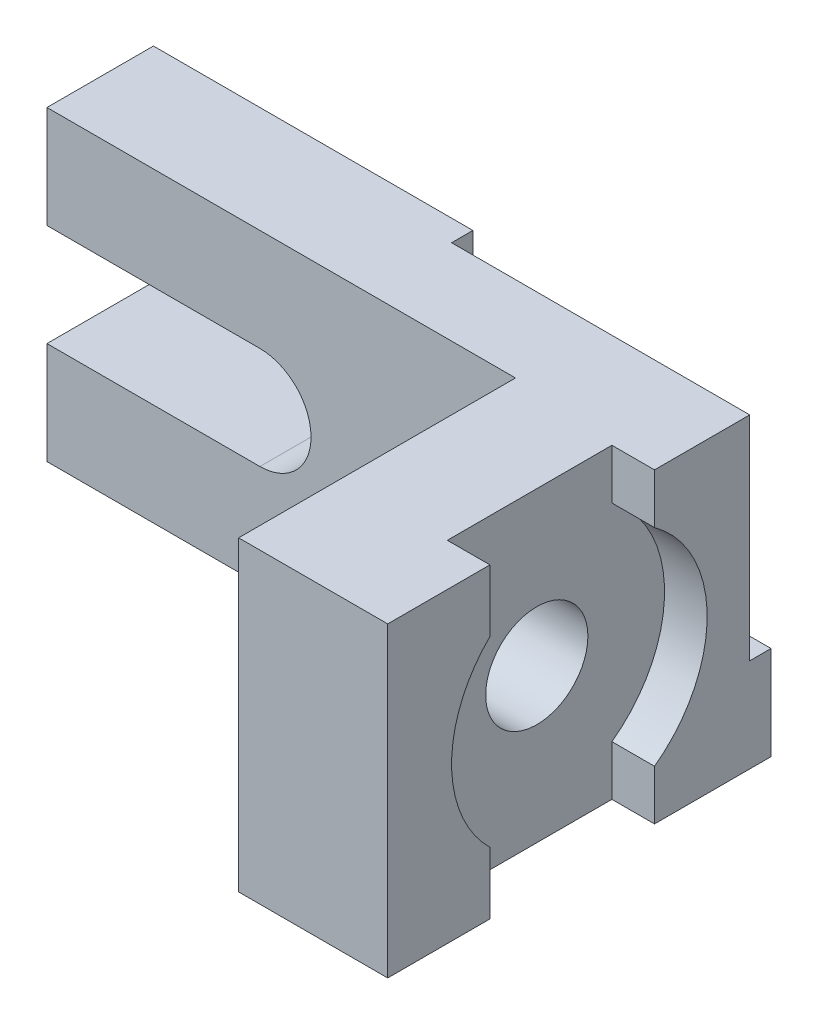
ISO-10303-21;
HEADER;
FILE_DESCRIPTION(('STEP AP214'),'2;1');
FILE_NAME('part.step','',(''),(''),'','','');
FILE_SCHEMA(('AUTOMOTIVE_DESIGN { 1 0 10303 214 1 1 1 1 }'));
ENDSEC;
DATA;
#1=APPLICATION_CONTEXT('core data for automotive mechanical design processes');
#2=APPLICATION_PROTOCOL_DEFINITION('international standard','automotive_design',2000,#1);
#3=PRODUCT_CONTEXT('',#1,'mechanical');
#4=PRODUCT('Part','Part','',(#3));
#5=PRODUCT_RELATED_PRODUCT_CATEGORY('part','',(#4));
#6=PRODUCT_DEFINITION_FORMATION('','',#4);
#7=PRODUCT_DEFINITION_CONTEXT('part definition',#1,'design');
#8=PRODUCT_DEFINITION('design','',#6,#7);
#9=PRODUCT_DEFINITION_SHAPE('','',#8);
#10=(LENGTH_UNIT() NAMED_UNIT(*) SI_UNIT(.MILLI.,.METRE.));
#11=(NAMED_UNIT(*) PLANE_ANGLE_UNIT() SI_UNIT($,.RADIAN.));
#12=(NAMED_UNIT(*) SI_UNIT($,.STERADIAN.) SOLID_ANGLE_UNIT());
#13=UNCERTAINTY_MEASURE_WITH_UNIT(LENGTH_MEASURE(1.E-05),#10,'distance_accuracy_value','');
#14=(GEOMETRIC_REPRESENTATION_CONTEXT(3) GLOBAL_UNCERTAINTY_ASSIGNED_CONTEXT((#13)) GLOBAL_UNIT_ASSIGNED_CONTEXT((#10,
#11,#12)) REPRESENTATION_CONTEXT('',''));
#15=CARTESIAN_POINT('',(0.,0.,0.));
#16=DIRECTION('',(0.,0.,1.));
#17=DIRECTION('',(1.,0.,0.));
#18=AXIS2_PLACEMENT_3D('',#15,#16,#17);
#19=CARTESIAN_POINT('',(-145.,36.,0.));
#20=DIRECTION('',(1.,0.,0.));
#21=DIRECTION('',(0.,0.,-1.));
#22=AXIS2_PLACEMENT_3D('',#19,#20,#21);
#23=PLANE('',#22);
#24=DIRECTION('',(0.,-1.,0.));
#25=VECTOR('',#24,1.);
#26=CARTESIAN_POINT('',(-145.,36.,25.));
#27=LINE('',#26,#25);
#28=CARTESIAN_POINT('',(-145.,-12.,25.));
#29=VERTEX_POINT('',#28);
#30=CARTESIAN_POINT('',(-145.,-36.,25.));
#31=VERTEX_POINT('',#30);
#32=EDGE_CURVE('E208',#29,#31,#27,.T.);
#33=ORIENTED_EDGE('',*,*,#32,.F.);
#34=DIRECTION('',(0.,0.,1.));
#35=VECTOR('',#34,1.);
#36=CARTESIAN_POINT('',(-145.,-12.,-45.));
#37=LINE('',#36,#35);
#38=CARTESIAN_POINT('',(-145.,-12.,0.));
#39=VERTEX_POINT('',#38);
#40=EDGE_CURVE('E202',#39,#29,#37,.T.);
#41=ORIENTED_EDGE('',*,*,#40,.F.);
#42=DIRECTION('',(0.,-1.,0.));
#43=VECTOR('',#42,1.);
#44=CARTESIAN_POINT('',(-145.,36.,0.));
#45=LINE('',#44,#43);
#46=CARTESIAN_POINT('',(-145.,-36.,0.));
#47=VERTEX_POINT('',#46);
#48=EDGE_CURVE('E207',#39,#47,#45,.T.);
#49=ORIENTED_EDGE('',*,*,#48,.T.);
#50=DIRECTION('',(0.,0.,1.));
#51=VECTOR('',#50,1.);
#52=CARTESIAN_POINT('',(-145.,-36.,0.));
#53=LINE('',#52,#51);
#54=EDGE_CURVE('E229',#47,#31,#53,.T.);
#55=ORIENTED_EDGE('',*,*,#54,.T.);
#56=EDGE_LOOP('',(#33,#41,#49,#55));
#57=FACE_BOUND('',#56,.T.);
#58=ADVANCED_FACE('F39',(#57),#23,.F.);
#59=CARTESIAN_POINT('',(0.,36.,90.));
#60=DIRECTION('',(-1.,0.,0.));
#61=DIRECTION('',(0.,0.,1.));
#62=AXIS2_PLACEMENT_3D('',#59,#60,#61);
#63=PLANE('',#62);
#64=DIRECTION('',(0.,-1.,0.));
#65=VECTOR('',#64,1.);
#66=CARTESIAN_POINT('',(0.,36.,0.));
#67=LINE('',#66,#65);
#68=CARTESIAN_POINT('',(0.,-14.,0.));
#69=VERTEX_POINT('',#68);
#70=CARTESIAN_POINT('',(0.,-36.,0.));
#71=VERTEX_POINT('',#70);
#72=EDGE_CURVE('E11',#69,#71,#67,.T.);
#73=ORIENTED_EDGE('',*,*,#72,.F.);
#74=DIRECTION('',(0.,0.,-1.));
#75=VECTOR('',#74,1.);
#76=CARTESIAN_POINT('',(0.,-14.,4.99999999999999));
#77=LINE('',#76,#75);
#78=CARTESIAN_POINT('',(0.,-14.,4.99999999999999));
#79=VERTEX_POINT('',#78);
#80=EDGE_CURVE('E305',#79,#69,#77,.T.);
#81=ORIENTED_EDGE('',*,*,#80,.F.);
#82=DIRECTION('',(0.,-1.,0.));
#83=VECTOR('',#82,1.);
#84=CARTESIAN_POINT('',(0.,36.,5.));
#85=LINE('',#84,#83);
#86=CARTESIAN_POINT('',(0.,36.,5.));
#87=VERTEX_POINT('',#86);
#88=EDGE_CURVE('E307',#87,#79,#85,.T.);
#89=ORIENTED_EDGE('',*,*,#88,.F.);
#90=DIRECTION('',(0.,0.,-1.));
#91=VECTOR('',#90,1.);
#92=CARTESIAN_POINT('',(0.,36.,90.));
#93=LINE('',#92,#91);
#94=CARTESIAN_POINT('',(0.,36.,27.3608706282374));
#95=VERTEX_POINT('',#94);
#96=EDGE_CURVE('E224',#95,#87,#93,.T.);
#97=ORIENTED_EDGE('',*,*,#96,.F.);
#98=DIRECTION('',(0.,1.,0.));
#99=VECTOR('',#98,1.);
#100=CARTESIAN_POINT('',(0.,-36.,27.3608706282374));
#101=LINE('',#100,#99);
#102=CARTESIAN_POINT('',(0.,24.2664607020929,27.3608706282374));
#103=VERTEX_POINT('',#102);
#104=EDGE_CURVE('E278',#103,#95,#101,.T.);
#105=ORIENTED_EDGE('',*,*,#104,.F.);
#106=CARTESIAN_POINT('',(0.,0.,45.));
#107=DIRECTION('',(-1.,0.,0.));
#108=DIRECTION('',(0.,0.,1.));
#109=AXIS2_PLACEMENT_3D('',#106,#107,#108);
#110=CIRCLE('',#109,30.);
#111=CARTESIAN_POINT('',(0.,-24.2664607020929,27.3608706282374));
#112=VERTEX_POINT('',#111);
#113=EDGE_CURVE('E413',#112,#103,#110,.F.);
#114=ORIENTED_EDGE('',*,*,#113,.F.);
#115=CARTESIAN_POINT('',(0.,-36.,27.3608706282374));
#116=VERTEX_POINT('',#115);
#117=EDGE_CURVE('E275',#116,#112,#101,.T.);
#118=ORIENTED_EDGE('',*,*,#117,.F.);
#119=DIRECTION('',(0.,0.,-1.));
#120=VECTOR('',#119,1.);
#121=CARTESIAN_POINT('',(0.,-36.,90.));
#122=LINE('',#121,#120);
#123=EDGE_CURVE('E238',#116,#71,#122,.T.);
#124=ORIENTED_EDGE('',*,*,#123,.T.);
#125=EDGE_LOOP('',(#73,#81,#89,#97,#105,#114,#118,#124));
#126=FACE_BOUND('',#125,.T.);
#127=ADVANCED_FACE('F373',(#126),#63,.F.);
#128=CARTESIAN_POINT('',(1.2E-05,0.,45.));
#129=DIRECTION('',(-1.,0.,0.));
#130=DIRECTION('',(0.,0.,1.));
#131=AXIS2_PLACEMENT_3D('',#128,#129,#130);
#132=CYLINDRICAL_SURFACE('',#131,30.);
#133=DIRECTION('',(-1.,0.,0.));
#134=VECTOR('',#133,1.);
#135=CARTESIAN_POINT('',(1.2E-05,-24.2664607020929,27.3608706282374));
#136=LINE('',#135,#134);
#137=CARTESIAN_POINT('',(-10.,-24.2664607020929,27.3608706282374));
#138=VERTEX_POINT('',#137);
#139=EDGE_CURVE('E254',#112,#138,#136,.T.);
#140=ORIENTED_EDGE('',*,*,#139,.F.);
#141=ORIENTED_EDGE('',*,*,#113,.T.);
#142=DIRECTION('',(-1.,0.,0.));
#143=VECTOR('',#142,1.);
#144=CARTESIAN_POINT('',(1.2E-05,24.2664607020929,27.3608706282374));
#145=LINE('',#144,#143);
#146=CARTESIAN_POINT('',(-10.,24.2664607020929,27.3608706282374));
#147=VERTEX_POINT('',#146);
#148=EDGE_CURVE('E257',#147,#103,#145,.F.);
#149=ORIENTED_EDGE('',*,*,#148,.F.);
#150=CARTESIAN_POINT('',(-10.,0.,45.));
#151=DIRECTION('',(1.,0.,0.));
#152=DIRECTION('',(0.,0.,-1.));
#153=AXIS2_PLACEMENT_3D('',#150,#151,#152);
#154=CIRCLE('',#153,30.);
#155=EDGE_CURVE('E250',#138,#147,#154,.T.);
#156=ORIENTED_EDGE('',*,*,#155,.F.);
#157=EDGE_LOOP('',(#140,#141,#149,#156));
#158=FACE_BOUND('',#157,.T.);
#159=ADVANCED_FACE('F379',(#158),#132,.F.);
#160=CARTESIAN_POINT('',(0.,-36.,90.));
#161=VERTEX_POINT('',#160);
#162=CARTESIAN_POINT('',(0.,-36.,66.));
#163=VERTEX_POINT('',#162);
#164=EDGE_CURVE('E235',#161,#163,#122,.T.);
#165=ORIENTED_EDGE('',*,*,#164,.T.);
#166=DIRECTION('',(0.,-1.,0.));
#167=VECTOR('',#166,1.);
#168=CARTESIAN_POINT('',(0.,-36.,66.));
#169=LINE('',#168,#167);
#170=CARTESIAN_POINT('',(0.,-21.4242852856285,66.));
#171=VERTEX_POINT('',#170);
#172=EDGE_CURVE('E281',#171,#163,#169,.T.);
#173=ORIENTED_EDGE('',*,*,#172,.F.);
#174=CARTESIAN_POINT('',(0.,21.4242852856285,66.));
#175=VERTEX_POINT('',#174);
#176=EDGE_CURVE('E43',#175,#171,#110,.F.);
#177=ORIENTED_EDGE('',*,*,#176,.F.);
#178=CARTESIAN_POINT('',(0.,36.,66.));
#179=VERTEX_POINT('',#178);
#180=EDGE_CURVE('E279',#179,#175,#169,.T.);
#181=ORIENTED_EDGE('',*,*,#180,.F.);
#182=CARTESIAN_POINT('',(0.,36.,90.));
#183=VERTEX_POINT('',#182);
#184=EDGE_CURVE('E247',#183,#179,#93,.T.);
#185=ORIENTED_EDGE('',*,*,#184,.F.);
#186=DIRECTION('',(0.,-1.,0.));
#187=VECTOR('',#186,1.);
#188=CARTESIAN_POINT('',(0.,36.,90.));
#189=LINE('',#188,#187);
#190=EDGE_CURVE('E218',#183,#161,#189,.T.);
#191=ORIENTED_EDGE('',*,*,#190,.T.);
#192=EDGE_LOOP('',(#165,#173,#177,#181,#185,#191));
#193=FACE_BOUND('',#192,.T.);
#194=ADVANCED_FACE('F41',(#193),#63,.F.);
#195=CARTESIAN_POINT('',(0.,36.,0.));
#196=DIRECTION('',(0.,0.,1.));
#197=DIRECTION('',(1.,0.,0.));
#198=AXIS2_PLACEMENT_3D('',#195,#196,#197);
#199=PLANE('',#198);
#200=ORIENTED_EDGE('',*,*,#48,.F.);
#201=DIRECTION('',(1.,0.,0.));
#202=VECTOR('',#201,1.);
#203=CARTESIAN_POINT('',(0.,-12.,0.));
#204=LINE('',#203,#202);
#205=CARTESIAN_POINT('',(-95.,-12.,0.));
#206=VERTEX_POINT('',#205);
#207=EDGE_CURVE('E320',#39,#206,#204,.T.);
#208=ORIENTED_EDGE('',*,*,#207,.T.);
#209=CARTESIAN_POINT('',(-95.,0.,0.));
#210=DIRECTION('',(0.,0.,1.));
#211=DIRECTION('',(1.,0.,0.));
#212=AXIS2_PLACEMENT_3D('',#209,#210,#211);
#213=CIRCLE('',#212,12.);
#214=CARTESIAN_POINT('',(-95.,12.,0.));
#215=VERTEX_POINT('',#214);
#216=EDGE_CURVE('E310',#206,#215,#213,.T.);
#217=ORIENTED_EDGE('',*,*,#216,.T.);
#218=DIRECTION('',(-1.,0.,0.));
#219=VECTOR('',#218,1.);
#220=CARTESIAN_POINT('',(0.,12.,0.));
#221=LINE('',#220,#219);
#222=CARTESIAN_POINT('',(-145.,12.,0.));
#223=VERTEX_POINT('',#222);
#224=EDGE_CURVE('E323',#215,#223,#221,.T.);
#225=ORIENTED_EDGE('',*,*,#224,.T.);
#226=CARTESIAN_POINT('',(-145.,36.,0.));
#227=VERTEX_POINT('',#226);
#228=EDGE_CURVE('E48',#227,#223,#45,.T.);
#229=ORIENTED_EDGE('',*,*,#228,.F.);
#230=DIRECTION('',(-1.,0.,0.));
#231=VECTOR('',#230,1.);
#232=CARTESIAN_POINT('',(0.,36.,0.));
#233=LINE('',#232,#231);
#234=CARTESIAN_POINT('',(-70.,36.,0.));
#235=VERTEX_POINT('',#234);
#236=EDGE_CURVE('E245',#235,#227,#233,.T.);
#237=ORIENTED_EDGE('',*,*,#236,.F.);
#238=DIRECTION('',(0.,1.,0.));
#239=VECTOR('',#238,1.);
#240=CARTESIAN_POINT('',(-70.,-14.,0.));
#241=LINE('',#240,#239);
#242=CARTESIAN_POINT('',(-70.,-14.,0.));
#243=VERTEX_POINT('',#242);
#244=EDGE_CURVE('E63',#243,#235,#241,.T.);
#245=ORIENTED_EDGE('',*,*,#244,.F.);
#246=DIRECTION('',(1.,0.,0.));
#247=VECTOR('',#246,1.);
#248=CARTESIAN_POINT('',(-70.,-14.,0.));
#249=LINE('',#248,#247);
#250=EDGE_CURVE('E297',#243,#69,#249,.T.);
#251=ORIENTED_EDGE('',*,*,#250,.T.);
#252=ORIENTED_EDGE('',*,*,#72,.T.);
#253=DIRECTION('',(-1.,0.,0.));
#254=VECTOR('',#253,1.);
#255=CARTESIAN_POINT('',(0.,-36.,0.));
#256=LINE('',#255,#254);
#257=EDGE_CURVE('E232',#71,#47,#256,.T.);
#258=ORIENTED_EDGE('',*,*,#257,.T.);
#259=EDGE_LOOP('',(#200,#208,#217,#225,#229,#237,#245,#251,#252,#258));
#260=FACE_BOUND('',#259,.T.);
#261=ADVANCED_FACE('F358',(#260),#199,.F.);
#262=ORIENTED_EDGE('',*,*,#228,.T.);
#263=DIRECTION('',(0.,0.,1.));
#264=VECTOR('',#263,1.);
#265=CARTESIAN_POINT('',(-145.,12.,-45.));
#266=LINE('',#265,#264);
#267=CARTESIAN_POINT('',(-145.,12.,25.));
#268=VERTEX_POINT('',#267);
#269=EDGE_CURVE('E187',#223,#268,#266,.T.);
#270=ORIENTED_EDGE('',*,*,#269,.T.);
#271=CARTESIAN_POINT('',(-145.,36.,25.));
#272=VERTEX_POINT('',#271);
#273=EDGE_CURVE('E199',#272,#268,#27,.T.);
#274=ORIENTED_EDGE('',*,*,#273,.F.);
#275=DIRECTION('',(0.,0.,1.));
#276=VECTOR('',#275,1.);
#277=CARTESIAN_POINT('',(-145.,36.,0.));
#278=LINE('',#277,#276);
#279=EDGE_CURVE('E243',#227,#272,#278,.T.);
#280=ORIENTED_EDGE('',*,*,#279,.F.);
#281=EDGE_LOOP('',(#262,#270,#274,#280));
#282=FACE_BOUND('',#281,.T.);
#283=ADVANCED_FACE('F197',(#282),#23,.F.);
#284=CARTESIAN_POINT('',(-145.,36.,25.));
#285=DIRECTION('',(0.,0.,-1.));
#286=DIRECTION('',(-1.,0.,0.));
#287=AXIS2_PLACEMENT_3D('',#284,#285,#286);
#288=PLANE('',#287);
#289=CARTESIAN_POINT('',(-95.,0.,25.));
#290=DIRECTION('',(0.,0.,1.));
#291=DIRECTION('',(1.,0.,0.));
#292=AXIS2_PLACEMENT_3D('',#289,#290,#291);
#293=CIRCLE('',#292,12.);
#294=CARTESIAN_POINT('',(-95.,-12.,25.));
#295=VERTEX_POINT('',#294);
#296=CARTESIAN_POINT('',(-95.,12.,25.));
#297=VERTEX_POINT('',#296);
#298=EDGE_CURVE('E55',#295,#297,#293,.T.);
#299=ORIENTED_EDGE('',*,*,#298,.F.);
#300=DIRECTION('',(1.,0.,0.));
#301=VECTOR('',#300,1.);
#302=CARTESIAN_POINT('',(-95.,-12.,25.));
#303=LINE('',#302,#301);
#304=EDGE_CURVE('E192',#29,#295,#303,.T.);
#305=ORIENTED_EDGE('',*,*,#304,.F.);
#306=ORIENTED_EDGE('',*,*,#32,.T.);
#307=DIRECTION('',(1.,0.,0.));
#308=VECTOR('',#307,1.);
#309=CARTESIAN_POINT('',(-145.,-36.,25.));
#310=LINE('',#309,#308);
#311=CARTESIAN_POINT('',(-35.,-36.,25.));
#312=VERTEX_POINT('',#311);
#313=EDGE_CURVE('E227',#31,#312,#310,.T.);
#314=ORIENTED_EDGE('',*,*,#313,.T.);
#315=DIRECTION('',(0.,-1.,0.));
#316=VECTOR('',#315,1.);
#317=CARTESIAN_POINT('',(-35.,36.,25.));
#318=LINE('',#317,#316);
#319=CARTESIAN_POINT('',(-35.,36.,25.));
#320=VERTEX_POINT('',#319);
#321=EDGE_CURVE('E211',#320,#312,#318,.T.);
#322=ORIENTED_EDGE('',*,*,#321,.F.);
#323=DIRECTION('',(1.,0.,0.));
#324=VECTOR('',#323,1.);
#325=CARTESIAN_POINT('',(-145.,36.,25.));
#326=LINE('',#325,#324);
#327=EDGE_CURVE('E206',#272,#320,#326,.T.);
#328=ORIENTED_EDGE('',*,*,#327,.F.);
#329=ORIENTED_EDGE('',*,*,#273,.T.);
#330=DIRECTION('',(-1.,0.,0.));
#331=VECTOR('',#330,1.);
#332=CARTESIAN_POINT('',(-95.,12.,25.));
#333=LINE('',#332,#331);
#334=EDGE_CURVE('E184',#297,#268,#333,.T.);
#335=ORIENTED_EDGE('',*,*,#334,.F.);
#336=EDGE_LOOP('',(#299,#305,#306,#314,#322,#328,#329,#335));
#337=FACE_BOUND('',#336,.T.);
#338=ADVANCED_FACE('F204',(#337),#288,.F.);
#339=CARTESIAN_POINT('',(-35.,36.,25.));
#340=DIRECTION('',(1.,0.,0.));
#341=DIRECTION('',(0.,0.,-1.));
#342=AXIS2_PLACEMENT_3D('',#339,#340,#341);
#343=PLANE('',#342);
#344=CARTESIAN_POINT('',(-35.,0.,45.));
#345=DIRECTION('',(1.,0.,0.));
#346=DIRECTION('',(0.,0.,-1.));
#347=AXIS2_PLACEMENT_3D('',#344,#345,#346);
#348=CIRCLE('',#347,12.);
#349=CARTESIAN_POINT('',(-35.,0.,33.));
#350=VERTEX_POINT('',#349);
#351=EDGE_CURVE('E291',#350,#350,#348,.T.);
#352=ORIENTED_EDGE('',*,*,#351,.T.);
#353=EDGE_LOOP('',(#352));
#354=FACE_BOUND('',#353,.T.);
#355=DIRECTION('',(0.,0.,1.));
#356=VECTOR('',#355,1.);
#357=CARTESIAN_POINT('',(-35.,-36.,25.));
#358=LINE('',#357,#356);
#359=CARTESIAN_POINT('',(-35.,-36.,90.));
#360=VERTEX_POINT('',#359);
#361=EDGE_CURVE('E225',#312,#360,#358,.T.);
#362=ORIENTED_EDGE('',*,*,#361,.T.);
#363=DIRECTION('',(0.,-1.,0.));
#364=VECTOR('',#363,1.);
#365=CARTESIAN_POINT('',(-35.,36.,90.));
#366=LINE('',#365,#364);
#367=CARTESIAN_POINT('',(-35.,36.,90.));
#368=VERTEX_POINT('',#367);
#369=EDGE_CURVE('E215',#368,#360,#366,.T.);
#370=ORIENTED_EDGE('',*,*,#369,.F.);
#371=DIRECTION('',(0.,0.,1.));
#372=VECTOR('',#371,1.);
#373=CARTESIAN_POINT('',(-35.,36.,25.));
#374=LINE('',#373,#372);
#375=EDGE_CURVE('E240',#320,#368,#374,.T.);
#376=ORIENTED_EDGE('',*,*,#375,.F.);
#377=ORIENTED_EDGE('',*,*,#321,.T.);
#378=EDGE_LOOP('',(#362,#370,#376,#377));
#379=FACE_BOUND('',#378,.T.);
#380=ADVANCED_FACE('F349',(#354,#379),#343,.F.);
#381=CARTESIAN_POINT('',(-35.,36.,90.));
#382=DIRECTION('',(0.,0.,-1.));
#383=DIRECTION('',(-1.,0.,0.));
#384=AXIS2_PLACEMENT_3D('',#381,#382,#383);
#385=PLANE('',#384);
#386=DIRECTION('',(1.,0.,0.));
#387=VECTOR('',#386,1.);
#388=CARTESIAN_POINT('',(-35.,-36.,90.));
#389=LINE('',#388,#387);
#390=EDGE_CURVE('E222',#360,#161,#389,.T.);
#391=ORIENTED_EDGE('',*,*,#390,.T.);
#392=ORIENTED_EDGE('',*,*,#190,.F.);
#393=DIRECTION('',(1.,0.,0.));
#394=VECTOR('',#393,1.);
#395=CARTESIAN_POINT('',(-35.,36.,90.));
#396=LINE('',#395,#394);
#397=EDGE_CURVE('E221',#368,#183,#396,.T.);
#398=ORIENTED_EDGE('',*,*,#397,.F.);
#399=ORIENTED_EDGE('',*,*,#369,.T.);
#400=EDGE_LOOP('',(#391,#392,#398,#399));
#401=FACE_BOUND('',#400,.T.);
#402=ADVANCED_FACE('F563',(#401),#385,.F.);
#403=CARTESIAN_POINT('',(0.,36.,0.));
#404=DIRECTION('',(0.,1.,0.));
#405=DIRECTION('',(0.,0.,1.));
#406=AXIS2_PLACEMENT_3D('',#403,#404,#405);
#407=PLANE('',#406);
#408=DIRECTION('',(1.,0.,0.));
#409=VECTOR('',#408,1.);
#410=CARTESIAN_POINT('',(-70.,36.,5.));
#411=LINE('',#410,#409);
#412=CARTESIAN_POINT('',(-70.,36.,5.));
#413=VERTEX_POINT('',#412);
#414=EDGE_CURVE('E298',#413,#87,#411,.T.);
#415=ORIENTED_EDGE('',*,*,#414,.F.);
#416=DIRECTION('',(0.,0.,1.));
#417=VECTOR('',#416,1.);
#418=CARTESIAN_POINT('',(-70.,36.,0.));
#419=LINE('',#418,#417);
#420=EDGE_CURVE('E315',#235,#413,#419,.T.);
#421=ORIENTED_EDGE('',*,*,#420,.F.);
#422=ORIENTED_EDGE('',*,*,#236,.T.);
#423=ORIENTED_EDGE('',*,*,#279,.T.);
#424=ORIENTED_EDGE('',*,*,#327,.T.);
#425=ORIENTED_EDGE('',*,*,#375,.T.);
#426=ORIENTED_EDGE('',*,*,#397,.T.);
#427=ORIENTED_EDGE('',*,*,#184,.T.);
#428=DIRECTION('',(1.,0.,0.));
#429=VECTOR('',#428,1.);
#430=CARTESIAN_POINT('',(-10.,36.,66.));
#431=LINE('',#430,#429);
#432=CARTESIAN_POINT('',(-10.,36.,66.));
#433=VERTEX_POINT('',#432);
#434=EDGE_CURVE('E265',#433,#179,#431,.T.);
#435=ORIENTED_EDGE('',*,*,#434,.F.);
#436=DIRECTION('',(0.,0.,1.));
#437=VECTOR('',#436,1.);
#438=CARTESIAN_POINT('',(-10.,36.,66.));
#439=LINE('',#438,#437);
#440=CARTESIAN_POINT('',(-10.,36.,27.3608706282374));
#441=VERTEX_POINT('',#440);
#442=EDGE_CURVE('E277',#441,#433,#439,.T.);
#443=ORIENTED_EDGE('',*,*,#442,.F.);
#444=DIRECTION('',(1.,0.,0.));
#445=VECTOR('',#444,1.);
#446=CARTESIAN_POINT('',(-10.,36.,27.3608706282374));
#447=LINE('',#446,#445);
#448=EDGE_CURVE('E264',#441,#95,#447,.T.);
#449=ORIENTED_EDGE('',*,*,#448,.T.);
#450=ORIENTED_EDGE('',*,*,#96,.T.);
#451=EDGE_LOOP('',(#415,#421,#422,#423,#424,#425,#426,#427,#435,#443,#449,#450));
#452=FACE_BOUND('',#451,.T.);
#453=ADVANCED_FACE('F354',(#452),#407,.T.);
#454=CARTESIAN_POINT('',(0.,-36.,0.));
#455=DIRECTION('',(0.,1.,0.));
#456=DIRECTION('',(0.,0.,1.));
#457=AXIS2_PLACEMENT_3D('',#454,#455,#456);
#458=PLANE('',#457);
#459=ORIENTED_EDGE('',*,*,#123,.F.);
#460=DIRECTION('',(1.,0.,0.));
#461=VECTOR('',#460,1.);
#462=CARTESIAN_POINT('',(-10.,-36.,27.3608706282374));
#463=LINE('',#462,#461);
#464=CARTESIAN_POINT('',(-10.,-36.,27.3608706282374));
#465=VERTEX_POINT('',#464);
#466=EDGE_CURVE('E271',#465,#116,#463,.T.);
#467=ORIENTED_EDGE('',*,*,#466,.F.);
#468=DIRECTION('',(0.,0.,-1.));
#469=VECTOR('',#468,1.);
#470=CARTESIAN_POINT('',(-10.,-36.,66.));
#471=LINE('',#470,#469);
#472=CARTESIAN_POINT('',(-10.,-36.,66.));
#473=VERTEX_POINT('',#472);
#474=EDGE_CURVE('E284',#473,#465,#471,.T.);
#475=ORIENTED_EDGE('',*,*,#474,.F.);
#476=DIRECTION('',(1.,0.,0.));
#477=VECTOR('',#476,1.);
#478=CARTESIAN_POINT('',(-10.,-36.,66.));
#479=LINE('',#478,#477);
#480=EDGE_CURVE('E267',#473,#163,#479,.T.);
#481=ORIENTED_EDGE('',*,*,#480,.T.);
#482=ORIENTED_EDGE('',*,*,#164,.F.);
#483=ORIENTED_EDGE('',*,*,#390,.F.);
#484=ORIENTED_EDGE('',*,*,#361,.F.);
#485=ORIENTED_EDGE('',*,*,#313,.F.);
#486=ORIENTED_EDGE('',*,*,#54,.F.);
#487=ORIENTED_EDGE('',*,*,#257,.F.);
#488=EDGE_LOOP('',(#459,#467,#475,#481,#482,#483,#484,#485,#486,#487));
#489=FACE_BOUND('',#488,.T.);
#490=ADVANCED_FACE('F345',(#489),#458,.F.);
#491=DIRECTION('',(-1.,0.,0.));
#492=VECTOR('',#491,1.);
#493=CARTESIAN_POINT('',(1.2E-05,21.4242852856285,66.));
#494=LINE('',#493,#492);
#495=CARTESIAN_POINT('',(-10.,21.4242852856285,66.));
#496=VERTEX_POINT('',#495);
#497=EDGE_CURVE('E259',#175,#496,#494,.T.);
#498=ORIENTED_EDGE('',*,*,#497,.F.);
#499=ORIENTED_EDGE('',*,*,#176,.T.);
#500=DIRECTION('',(-1.,0.,0.));
#501=VECTOR('',#500,1.);
#502=CARTESIAN_POINT('',(1.2E-05,-21.4242852856285,66.));
#503=LINE('',#502,#501);
#504=CARTESIAN_POINT('',(-10.,-21.4242852856285,66.));
#505=VERTEX_POINT('',#504);
#506=EDGE_CURVE('E262',#505,#171,#503,.F.);
#507=ORIENTED_EDGE('',*,*,#506,.F.);
#508=EDGE_CURVE('E253',#496,#505,#154,.T.);
#509=ORIENTED_EDGE('',*,*,#508,.F.);
#510=EDGE_LOOP('',(#498,#499,#507,#509));
#511=FACE_BOUND('',#510,.T.);
#512=ADVANCED_FACE('F395',(#511),#132,.F.);
#513=CARTESIAN_POINT('',(-10.,0.,45.));
#514=DIRECTION('',(1.,0.,0.));
#515=DIRECTION('',(0.,0.,-1.));
#516=AXIS2_PLACEMENT_3D('',#513,#514,#515);
#517=PLANE('',#516);
#518=CARTESIAN_POINT('',(-10.,0.,45.));
#519=DIRECTION('',(1.,0.,0.));
#520=DIRECTION('',(0.,0.,-1.));
#521=AXIS2_PLACEMENT_3D('',#518,#519,#520);
#522=CIRCLE('',#521,12.);
#523=CARTESIAN_POINT('',(-10.,0.,33.));
#524=VERTEX_POINT('',#523);
#525=EDGE_CURVE('E294',#524,#524,#522,.T.);
#526=ORIENTED_EDGE('',*,*,#525,.F.);
#527=EDGE_LOOP('',(#526));
#528=FACE_BOUND('',#527,.T.);
#529=ORIENTED_EDGE('',*,*,#508,.T.);
#530=DIRECTION('',(0.,-1.,0.));
#531=VECTOR('',#530,1.);
#532=CARTESIAN_POINT('',(-10.,-36.,66.));
#533=LINE('',#532,#531);
#534=EDGE_CURVE('E288',#505,#473,#533,.T.);
#535=ORIENTED_EDGE('',*,*,#534,.T.);
#536=ORIENTED_EDGE('',*,*,#474,.T.);
#537=DIRECTION('',(0.,1.,0.));
#538=VECTOR('',#537,1.);
#539=CARTESIAN_POINT('',(-10.,-36.,27.3608706282374));
#540=LINE('',#539,#538);
#541=EDGE_CURVE('E268',#465,#138,#540,.T.);
#542=ORIENTED_EDGE('',*,*,#541,.T.);
#543=ORIENTED_EDGE('',*,*,#155,.T.);
#544=EDGE_CURVE('E283',#147,#441,#540,.T.);
#545=ORIENTED_EDGE('',*,*,#544,.T.);
#546=ORIENTED_EDGE('',*,*,#442,.T.);
#547=EDGE_CURVE('E286',#433,#496,#533,.T.);
#548=ORIENTED_EDGE('',*,*,#547,.T.);
#549=EDGE_LOOP('',(#529,#535,#536,#542,#543,#545,#546,#548));
#550=FACE_BOUND('',#549,.T.);
#551=ADVANCED_FACE('F412',(#528,#550),#517,.T.);
#552=CARTESIAN_POINT('',(-10.,-36.,66.));
#553=DIRECTION('',(0.,0.,1.));
#554=DIRECTION('',(1.,0.,0.));
#555=AXIS2_PLACEMENT_3D('',#552,#553,#554);
#556=PLANE('',#555);
#557=ORIENTED_EDGE('',*,*,#506,.T.);
#558=ORIENTED_EDGE('',*,*,#172,.T.);
#559=ORIENTED_EDGE('',*,*,#480,.F.);
#560=ORIENTED_EDGE('',*,*,#534,.F.);
#561=EDGE_LOOP('',(#557,#558,#559,#560));
#562=FACE_BOUND('',#561,.T.);
#563=ADVANCED_FACE('F405',(#562),#556,.F.);
#564=CARTESIAN_POINT('',(-10.,-36.,27.3608706282374));
#565=DIRECTION('',(0.,0.,-1.));
#566=DIRECTION('',(-1.,0.,0.));
#567=AXIS2_PLACEMENT_3D('',#564,#565,#566);
#568=PLANE('',#567);
#569=ORIENTED_EDGE('',*,*,#139,.T.);
#570=ORIENTED_EDGE('',*,*,#541,.F.);
#571=ORIENTED_EDGE('',*,*,#466,.T.);
#572=ORIENTED_EDGE('',*,*,#117,.T.);
#573=EDGE_LOOP('',(#569,#570,#571,#572));
#574=FACE_BOUND('',#573,.T.);
#575=ADVANCED_FACE('F438',(#574),#568,.F.);
#576=ORIENTED_EDGE('',*,*,#497,.T.);
#577=ORIENTED_EDGE('',*,*,#547,.F.);
#578=ORIENTED_EDGE('',*,*,#434,.T.);
#579=ORIENTED_EDGE('',*,*,#180,.T.);
#580=EDGE_LOOP('',(#576,#577,#578,#579));
#581=FACE_BOUND('',#580,.T.);
#582=ADVANCED_FACE('F440',(#581),#556,.F.);
#583=ORIENTED_EDGE('',*,*,#148,.T.);
#584=ORIENTED_EDGE('',*,*,#104,.T.);
#585=ORIENTED_EDGE('',*,*,#448,.F.);
#586=ORIENTED_EDGE('',*,*,#544,.F.);
#587=EDGE_LOOP('',(#583,#584,#585,#586));
#588=FACE_BOUND('',#587,.T.);
#589=ADVANCED_FACE('F434',(#588),#568,.F.);
#590=CARTESIAN_POINT('',(-145.,0.,45.));
#591=DIRECTION('',(1.,0.,0.));
#592=DIRECTION('',(0.,0.,-1.));
#593=AXIS2_PLACEMENT_3D('',#590,#591,#592);
#594=CYLINDRICAL_SURFACE('',#593,12.);
#595=ORIENTED_EDGE('',*,*,#525,.T.);
#596=EDGE_LOOP('',(#595));
#597=FACE_BOUND('',#596,.T.);
#598=ORIENTED_EDGE('',*,*,#351,.F.);
#599=EDGE_LOOP('',(#598));
#600=FACE_BOUND('',#599,.T.);
#601=ADVANCED_FACE('F450',(#597,#600),#594,.F.);
#602=CARTESIAN_POINT('',(-70.,-14.,4.99999999999999));
#603=DIRECTION('',(0.,-1.,0.));
#604=DIRECTION('',(0.,0.,-1.));
#605=AXIS2_PLACEMENT_3D('',#602,#603,#604);
#606=PLANE('',#605);
#607=ORIENTED_EDGE('',*,*,#80,.T.);
#608=ORIENTED_EDGE('',*,*,#250,.F.);
#609=DIRECTION('',(0.,0.,-1.));
#610=VECTOR('',#609,1.);
#611=CARTESIAN_POINT('',(-70.,-14.,4.99999999999999));
#612=LINE('',#611,#610);
#613=CARTESIAN_POINT('',(-70.,-14.,4.99999999999999));
#614=VERTEX_POINT('',#613);
#615=EDGE_CURVE('E301',#614,#243,#612,.T.);
#616=ORIENTED_EDGE('',*,*,#615,.F.);
#617=DIRECTION('',(1.,0.,0.));
#618=VECTOR('',#617,1.);
#619=CARTESIAN_POINT('',(-70.,-14.,4.99999999999999));
#620=LINE('',#619,#618);
#621=EDGE_CURVE('E300',#614,#79,#620,.T.);
#622=ORIENTED_EDGE('',*,*,#621,.T.);
#623=EDGE_LOOP('',(#607,#608,#616,#622));
#624=FACE_BOUND('',#623,.T.);
#625=ADVANCED_FACE('F424',(#624),#606,.F.);
#626=CARTESIAN_POINT('',(-70.,36.,5.));
#627=DIRECTION('',(0.,0.,1.));
#628=DIRECTION('',(0.,-1.,0.));
#629=AXIS2_PLACEMENT_3D('',#626,#627,#628);
#630=PLANE('',#629);
#631=ORIENTED_EDGE('',*,*,#88,.T.);
#632=ORIENTED_EDGE('',*,*,#621,.F.);
#633=DIRECTION('',(0.,-1.,0.));
#634=VECTOR('',#633,1.);
#635=CARTESIAN_POINT('',(-70.,36.,5.));
#636=LINE('',#635,#634);
#637=EDGE_CURVE('E312',#413,#614,#636,.T.);
#638=ORIENTED_EDGE('',*,*,#637,.F.);
#639=ORIENTED_EDGE('',*,*,#414,.T.);
#640=EDGE_LOOP('',(#631,#632,#638,#639));
#641=FACE_BOUND('',#640,.T.);
#642=ADVANCED_FACE('F369',(#641),#630,.F.);
#643=CARTESIAN_POINT('',(-70.,0.,0.));
#644=DIRECTION('',(1.,0.,0.));
#645=DIRECTION('',(0.,0.,-1.));
#646=AXIS2_PLACEMENT_3D('',#643,#644,#645);
#647=PLANE('',#646);
#648=ORIENTED_EDGE('',*,*,#244,.T.);
#649=ORIENTED_EDGE('',*,*,#420,.T.);
#650=ORIENTED_EDGE('',*,*,#637,.T.);
#651=ORIENTED_EDGE('',*,*,#615,.T.);
#652=EDGE_LOOP('',(#648,#649,#650,#651));
#653=FACE_BOUND('',#652,.T.);
#654=ADVANCED_FACE('F361',(#653),#647,.T.);
#655=CARTESIAN_POINT('',(-95.,0.,-45.));
#656=DIRECTION('',(0.,0.,1.));
#657=DIRECTION('',(1.,0.,0.));
#658=AXIS2_PLACEMENT_3D('',#655,#656,#657);
#659=CYLINDRICAL_SURFACE('',#658,12.);
#660=DIRECTION('',(0.,0.,1.));
#661=VECTOR('',#660,1.);
#662=CARTESIAN_POINT('',(-95.,-12.,-45.));
#663=LINE('',#662,#661);
#664=EDGE_CURVE('E325',#206,#295,#663,.T.);
#665=ORIENTED_EDGE('',*,*,#664,.T.);
#666=ORIENTED_EDGE('',*,*,#298,.T.);
#667=DIRECTION('',(0.,0.,1.));
#668=VECTOR('',#667,1.);
#669=CARTESIAN_POINT('',(-95.,12.,-45.));
#670=LINE('',#669,#668);
#671=EDGE_CURVE('E189',#215,#297,#670,.T.);
#672=ORIENTED_EDGE('',*,*,#671,.F.);
#673=ORIENTED_EDGE('',*,*,#216,.F.);
#674=EDGE_LOOP('',(#665,#666,#672,#673));
#675=FACE_BOUND('',#674,.T.);
#676=ADVANCED_FACE('F359',(#675),#659,.F.);
#677=CARTESIAN_POINT('',(-95.,-12.,-45.));
#678=DIRECTION('',(0.,-1.,0.));
#679=DIRECTION('',(1.,0.,0.));
#680=AXIS2_PLACEMENT_3D('',#677,#678,#679);
#681=PLANE('',#680);
#682=ORIENTED_EDGE('',*,*,#40,.T.);
#683=ORIENTED_EDGE('',*,*,#304,.T.);
#684=ORIENTED_EDGE('',*,*,#664,.F.);
#685=ORIENTED_EDGE('',*,*,#207,.F.);
#686=EDGE_LOOP('',(#682,#683,#684,#685));
#687=FACE_BOUND('',#686,.T.);
#688=ADVANCED_FACE('F334',(#687),#681,.F.);
#689=CARTESIAN_POINT('',(-95.,12.,-45.));
#690=DIRECTION('',(0.,1.,0.));
#691=DIRECTION('',(-1.,0.,0.));
#692=AXIS2_PLACEMENT_3D('',#689,#690,#691);
#693=PLANE('',#692);
#694=ORIENTED_EDGE('',*,*,#671,.T.);
#695=ORIENTED_EDGE('',*,*,#334,.T.);
#696=ORIENTED_EDGE('',*,*,#269,.F.);
#697=ORIENTED_EDGE('',*,*,#224,.F.);
#698=EDGE_LOOP('',(#694,#695,#696,#697));
#699=FACE_BOUND('',#698,.T.);
#700=ADVANCED_FACE('F186',(#699),#693,.F.);
#701=CLOSED_SHELL('',(#58,#127,#159,#194,#261,#283,#338,#380,#402,#453,#490,#512,#551,#563,#575,
#582,#589,#601,#625,#642,#654,#676,#688,#700));
#702=MANIFOLD_SOLID_BREP('B2',#701);
#703=ADVANCED_BREP_SHAPE_REPRESENTATION('',(#18,#702),#14);
#704=SHAPE_DEFINITION_REPRESENTATION(#9,#703);
ENDSEC;
END-ISO-10303-21;
